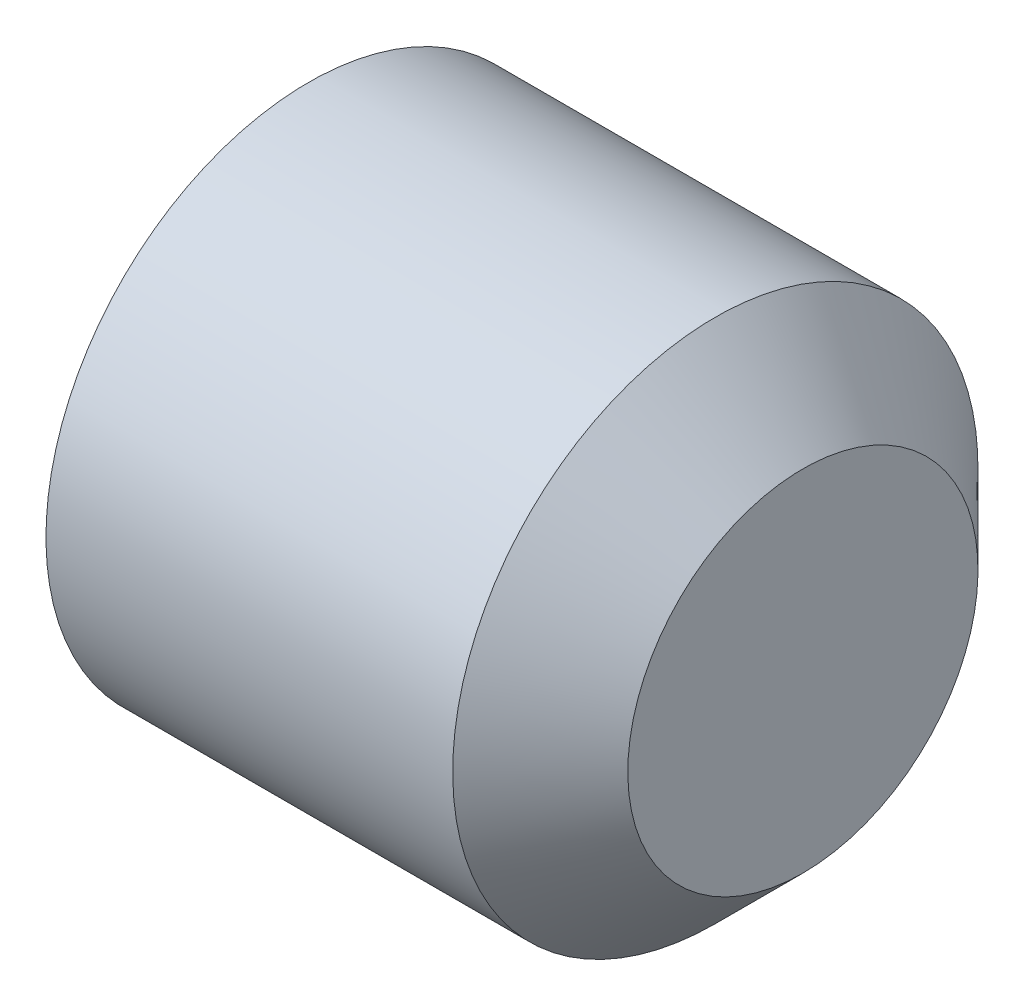
ISO-10303-21;
HEADER;
FILE_DESCRIPTION(('STEP AP214'),'2;1');
FILE_NAME('part.step','',(''),(''),'','','');
FILE_SCHEMA(('AUTOMOTIVE_DESIGN { 1 0 10303 214 1 1 1 1 }'));
ENDSEC;
DATA;
#1=APPLICATION_CONTEXT('core data for automotive mechanical design processes');
#2=APPLICATION_PROTOCOL_DEFINITION('international standard','automotive_design',2000,#1);
#3=PRODUCT_CONTEXT('',#1,'mechanical');
#4=PRODUCT('Part','Part','',(#3));
#5=PRODUCT_RELATED_PRODUCT_CATEGORY('part','',(#4));
#6=PRODUCT_DEFINITION_FORMATION('','',#4);
#7=PRODUCT_DEFINITION_CONTEXT('part definition',#1,'design');
#8=PRODUCT_DEFINITION('design','',#6,#7);
#9=PRODUCT_DEFINITION_SHAPE('','',#8);
#10=(LENGTH_UNIT() NAMED_UNIT(*) SI_UNIT(.MILLI.,.METRE.));
#11=(NAMED_UNIT(*) PLANE_ANGLE_UNIT() SI_UNIT($,.RADIAN.));
#12=(NAMED_UNIT(*) SI_UNIT($,.STERADIAN.) SOLID_ANGLE_UNIT());
#13=UNCERTAINTY_MEASURE_WITH_UNIT(LENGTH_MEASURE(1.E-05),#10,'distance_accuracy_value','');
#14=(GEOMETRIC_REPRESENTATION_CONTEXT(3) GLOBAL_UNCERTAINTY_ASSIGNED_CONTEXT((#13)) GLOBAL_UNIT_ASSIGNED_CONTEXT((#10,
#11,#12)) REPRESENTATION_CONTEXT('',''));
#15=CARTESIAN_POINT('',(0.,0.,0.));
#16=DIRECTION('',(0.,0.,1.));
#17=DIRECTION('',(1.,0.,0.));
#18=AXIS2_PLACEMENT_3D('',#15,#16,#17);
#19=CARTESIAN_POINT('',(0.5,0.,0.));
#20=DIRECTION('',(-1.,0.,0.));
#21=DIRECTION('',(0.,-1.,0.));
#22=AXIS2_PLACEMENT_3D('',#19,#20,#21);
#23=CONICAL_SURFACE('',#22,0.,1.0471975511966);
#24=CARTESIAN_POINT('',(0.,0.,0.));
#25=DIRECTION('',(-1.,0.,0.));
#26=DIRECTION('',(0.,-1.,0.));
#27=AXIS2_PLACEMENT_3D('',#24,#25,#26);
#28=CIRCLE('',#27,0.86602540378444);
#29=CARTESIAN_POINT('',(0.,0.,0.86602540378444));
#30=VERTEX_POINT('',#29);
#31=CARTESIAN_POINT('',(0.,0.75,0.433012701892222));
#32=VERTEX_POINT('',#31);
#33=EDGE_CURVE('E137',#30,#32,#28,.T.);
#34=ORIENTED_EDGE('',*,*,#33,.T.);
#35=CARTESIAN_POINT('',(-6.66799982216302E-05,0.7502,0.432897231838382));
#36=CARTESIAN_POINT('',(0.0109279672545947,0.717238666576004,0.451927466563575));
#37=CARTESIAN_POINT('',(0.0209278588304373,0.68399281869625,0.471121965786389));
#38=CARTESIAN_POINT('',(0.038384288073924,0.616925218141244,0.509843463020724));
#39=CARTESIAN_POINT('',(0.0458346476710156,0.583102272153654,0.529371149991445));
#40=CARTESIAN_POINT('',(0.0574342962607426,0.515875632570363,0.568184468451572));
#41=CARTESIAN_POINT('',(0.0616607517951379,0.482482293499614,0.58746412175321));
#42=CARTESIAN_POINT('',(0.0667098540533308,0.415538173911306,0.626114327218181));
#43=CARTESIAN_POINT('',(0.0675366780658326,0.381987637355588,0.645484738530082));
#44=CARTESIAN_POINT('',(0.065833231960248,0.319275698978884,0.681691493033275));
#45=CARTESIAN_POINT('',(0.0637212206264606,0.290104995811374,0.698533206359488));
#46=CARTESIAN_POINT('',(0.0570222121958374,0.231953671848458,0.73210688890321));
#47=CARTESIAN_POINT('',(0.0524329180465318,0.202973252776875,0.748838741655417));
#48=CARTESIAN_POINT('',(0.0409580031195664,0.144701650655193,0.782481866826481));
#49=CARTESIAN_POINT('',(0.0340236523302114,0.115417857581381,0.79938887264054));
#50=CARTESIAN_POINT('',(0.0182846224056368,0.0572874895838319,0.832950456252017));
#51=CARTESIAN_POINT('',(0.00948365081374576,0.0284401676519287,0.849605465334801));
#52=CARTESIAN_POINT('',(-6.66799982220191E-05,-0.000199999999999903,0.866140873838278));
#53=B_SPLINE_CURVE_WITH_KNOTS('',3,(#35,#36,#37,#38,#39,#40,#41,#42,#43,#44,#45,#46,#47,#48,#49,
#50,#51,#52),.UNSPECIFIED.,.F.,.F.,(4,2,2,2,2,2,2,2,4),(0.,0.118896819359341,0.238079744533805,
0.354311719456401,0.470400831872515,0.571553114284105,0.672799351342655,0.776293900714049,
0.87958477934405),.UNSPECIFIED.);
#54=EDGE_CURVE('E11',#32,#30,#53,.T.);
#55=ORIENTED_EDGE('',*,*,#54,.T.);
#56=EDGE_LOOP('',(#34,#55));
#57=FACE_BOUND('',#56,.T.);
#58=ADVANCED_FACE('F34',(#57),#23,.F.);
#59=CARTESIAN_POINT('',(0.,-0.75,0.43301270189222));
#60=VERTEX_POINT('',#59);
#61=EDGE_CURVE('E133',#60,#30,#28,.T.);
#62=ORIENTED_EDGE('',*,*,#61,.T.);
#63=CARTESIAN_POINT('',(-6.66799982221631E-05,0.000200000000000009,0.866140873838278));
#64=CARTESIAN_POINT('',(0.0109279672545943,-0.0327613334239957,0.847110639113085));
#65=CARTESIAN_POINT('',(0.0209278588304369,-0.0660071813037502,0.827916139890271));
#66=CARTESIAN_POINT('',(0.0383842880739238,-0.133074781858756,0.789194642655936));
#67=CARTESIAN_POINT('',(0.0458346476710154,-0.166897727846346,0.769666955685215));
#68=CARTESIAN_POINT('',(0.0574342962607425,-0.234124367429637,0.730853637225088));
#69=CARTESIAN_POINT('',(0.0616607517951379,-0.267517706500387,0.71157398392345));
#70=CARTESIAN_POINT('',(0.0667098540533308,-0.334461826088694,0.672923778458478));
#71=CARTESIAN_POINT('',(0.0675366780658327,-0.368012362644413,0.653553367146578));
#72=CARTESIAN_POINT('',(0.0658332319602481,-0.430724301021117,0.617346612643384));
#73=CARTESIAN_POINT('',(0.0637212206264609,-0.459895004188626,0.600504899317172));
#74=CARTESIAN_POINT('',(0.0570222121958376,-0.518046328151543,0.566931216773449));
#75=CARTESIAN_POINT('',(0.0524329180465321,-0.547026747223125,0.550199364021243));
#76=CARTESIAN_POINT('',(0.0409580031195668,-0.605298349344807,0.516556238850179));
#77=CARTESIAN_POINT('',(0.0340236523302119,-0.634582142418619,0.49964923303612));
#78=CARTESIAN_POINT('',(0.0182846224056374,-0.692712510416168,0.466087649424643));
#79=CARTESIAN_POINT('',(0.00948365081374636,-0.721559832348072,0.449432640341859));
#80=CARTESIAN_POINT('',(-6.6679998221416E-05,-0.7502,0.432897231838382));
#81=B_SPLINE_CURVE_WITH_KNOTS('',3,(#63,#64,#65,#66,#67,#68,#69,#70,#71,#72,#73,#74,#75,#76,#77,
#78,#79,#80),.UNSPECIFIED.,.F.,.F.,(4,2,2,2,2,2,2,2,4),(0.,0.118896819359341,0.238079744533806,
0.354311719456402,0.470400831872516,0.571553114284106,0.672799351342656,0.776293900714049,
0.87958477934405),.UNSPECIFIED.);
#82=EDGE_CURVE('E48',#30,#60,#81,.T.);
#83=ORIENTED_EDGE('',*,*,#82,.T.);
#84=EDGE_LOOP('',(#62,#83));
#85=FACE_BOUND('',#84,.T.);
#86=ADVANCED_FACE('F208',(#85),#23,.F.);
#87=CARTESIAN_POINT('',(0.,-0.75,-0.43301270189222));
#88=VERTEX_POINT('',#87);
#89=EDGE_CURVE('E132',#88,#60,#28,.T.);
#90=ORIENTED_EDGE('',*,*,#89,.T.);
#91=CARTESIAN_POINT('',(-0.278876466554599,-0.75,-1.1213588410753));
#92=CARTESIAN_POINT('',(-0.263336265513847,-0.75,-1.08897094569566));
#93=CARTESIAN_POINT('',(-0.247960254101356,-0.75,-1.05650461769235));
#94=CARTESIAN_POINT('',(-0.217622574828427,-0.75,-0.991372108674821));
#95=CARTESIAN_POINT('',(-0.202660981535683,-0.75,-0.958705892968621));
#96=CARTESIAN_POINT('',(-0.158358865523063,-0.75,-0.859967547804008));
#97=CARTESIAN_POINT('',(-0.129789394165184,-0.75,-0.793542929389712));
#98=CARTESIAN_POINT('',(-0.0751843648621228,-0.75,-0.657624750625179));
#99=CARTESIAN_POINT('',(-0.0492343798449783,-0.75,-0.588096337629301));
#100=CARTESIAN_POINT('',(-0.00305510516041329,-0.75,-0.4472488091812));
#101=CARTESIAN_POINT('',(0.0171890364428777,-0.75,-0.375934878791921));
#102=CARTESIAN_POINT('',(0.0406681724723913,-0.75,-0.267524989845908));
#103=CARTESIAN_POINT('',(0.047343676087413,-0.75,-0.23118312239164));
#104=CARTESIAN_POINT('',(0.0579431761785595,-0.75,-0.15809165305082));
#105=CARTESIAN_POINT('',(0.0618673585946982,-0.75,-0.121342078888484));
#106=CARTESIAN_POINT('',(0.0666007642621427,-0.75,-0.0480795367926938));
#107=CARTESIAN_POINT('',(0.0674467462415029,-0.75,-0.0115690096358278));
#108=CARTESIAN_POINT('',(0.0660502662725582,-0.75,0.0613915172782877));
#109=CARTESIAN_POINT('',(0.0638076130857623,-0.75,0.0978415131477214));
#110=CARTESIAN_POINT('',(0.0546612587546505,-0.75,0.187777191706421));
#111=CARTESIAN_POINT('',(0.0460435794249811,-0.75,0.241088938334563));
#112=CARTESIAN_POINT('',(0.0238197624153013,-0.75,0.346671776891812));
#113=CARTESIAN_POINT('',(0.0102076124427648,-0.75,0.398941534194197));
#114=CARTESIAN_POINT('',(-0.0209022912180242,-0.75,0.503561794942341));
#115=CARTESIAN_POINT('',(-0.0384803755428799,-0.75,0.555887795146071));
#116=CARTESIAN_POINT('',(-0.0761733658266929,-0.75,0.659578738588569));
#117=CARTESIAN_POINT('',(-0.0962873812846859,-0.75,0.710944011954183));
#118=CARTESIAN_POINT('',(-0.150040559931433,-0.75,0.841609169334977));
#119=CARTESIAN_POINT('',(-0.184929491266454,-0.75,0.92038989884234));
#120=CARTESIAN_POINT('',(-0.257158245348334,-0.75,1.07682093489163));
#121=CARTESIAN_POINT('',(-0.294498696792946,-0.75,1.15447094517097));
#122=CARTESIAN_POINT('',(-0.370753350440448,-0.75,1.30910230028642));
#123=CARTESIAN_POINT('',(-0.409669312305082,-0.75,1.38608277390296));
#124=CARTESIAN_POINT('',(-0.488505273193592,-0.75,1.53952831971992));
#125=CARTESIAN_POINT('',(-0.528425305368566,-0.75,1.61599337479695));
#126=CARTESIAN_POINT('',(-0.6051521411833,-0.75,1.76135282602859));
#127=CARTESIAN_POINT('',(-0.641896830705147,-0.75,1.83028007942956));
#128=CARTESIAN_POINT('',(-0.715804702425086,-0.75,1.9679128537899));
#129=CARTESIAN_POINT('',(-0.752967900110791,-0.75,2.0366183664215));
#130=CARTESIAN_POINT('',(-0.827513082986854,-0.75,2.17368403451686));
#131=CARTESIAN_POINT('',(-0.864894271247797,-0.75,2.24204462391346));
#132=CARTESIAN_POINT('',(-0.939899942981136,-0.75,2.37862759491475));
#133=CARTESIAN_POINT('',(-0.977524413618781,-0.75,2.44684998356505));
#134=CARTESIAN_POINT('',(-1.01523807504823,-0.75,2.51502271803409));
#135=B_SPLINE_CURVE_WITH_KNOTS('',3,(#91,#92,#93,#94,#95,#96,#97,#98,#99,#100,#101,#102,#103,
#104,#105,#106,#107,#108,#109,#110,#111,#112,#113,#114,#115,#116,#117,#118,#119,#120,#121,#122,
#123,#124,#125,#126,#127,#128,#129,#130,#131,#132,#133,#134),.UNSPECIFIED.,.F.,.F.,(4,2,2,2,2,2,
2,2,2,2,2,2,2,2,2,2,2,2,2,2,2,4),(0.,0.107767756928781,0.215554780551915,0.432420251910877,
0.654944617818952,0.876884302501297,0.987647541221339,1.0984032936094,1.20783201912744,
1.31726752042964,1.47894399847128,1.64081574297878,1.8063195007273,1.97176530228984,
2.23016383407581,2.48862889356041,2.74739105429863,3.00616176975601,3.24048926348677,
3.47482545759373,3.70856560604661,3.94229352217274),.UNSPECIFIED.);
#136=EDGE_CURVE('E182',#60,#88,#135,.F.);
#137=ORIENTED_EDGE('',*,*,#136,.T.);
#138=EDGE_LOOP('',(#90,#137));
#139=FACE_BOUND('',#138,.T.);
#140=ADVANCED_FACE('F214',(#139),#23,.F.);
#141=CARTESIAN_POINT('',(0.,0.,-0.86602540378444));
#142=VERTEX_POINT('',#141);
#143=EDGE_CURVE('E236',#142,#88,#28,.T.);
#144=ORIENTED_EDGE('',*,*,#143,.T.);
#145=CARTESIAN_POINT('',(-6.66799982214356E-05,-0.7502,-0.432897231838382));
#146=CARTESIAN_POINT('',(0.0109279672545948,-0.717238666576004,-0.451927466563575));
#147=CARTESIAN_POINT('',(0.0209278588304374,-0.68399281869625,-0.471121965786389));
#148=CARTESIAN_POINT('',(0.0383842880739242,-0.616925218141244,-0.509843463020724));
#149=CARTESIAN_POINT('',(0.0458346476710158,-0.583102272153654,-0.529371149991445));
#150=CARTESIAN_POINT('',(0.0574342962607427,-0.515875632570363,-0.568184468451572));
#151=CARTESIAN_POINT('',(0.061660751795138,-0.482482293499614,-0.58746412175321));
#152=CARTESIAN_POINT('',(0.0667098540533309,-0.415538173911306,-0.626114327218181));
#153=CARTESIAN_POINT('',(0.0675366780658328,-0.381987637355587,-0.645484738530082));
#154=CARTESIAN_POINT('',(0.0658332319602481,-0.319275698978883,-0.681691493033275));
#155=CARTESIAN_POINT('',(0.0637212206264607,-0.290104995811374,-0.698533206359488));
#156=CARTESIAN_POINT('',(0.0570222121958373,-0.231953671848458,-0.732106888903211));
#157=CARTESIAN_POINT('',(0.0524329180465317,-0.202973252776875,-0.748838741655417));
#158=CARTESIAN_POINT('',(0.0409580031195663,-0.144701650655193,-0.782481866826481));
#159=CARTESIAN_POINT('',(0.0340236523302114,-0.115417857581381,-0.79938887264054));
#160=CARTESIAN_POINT('',(0.0182846224056368,-0.0572874895838316,-0.832950456252017));
#161=CARTESIAN_POINT('',(0.00948365081374577,-0.0284401676519285,-0.849605465334801));
#162=CARTESIAN_POINT('',(-6.66799982221086E-05,0.000200000000000049,-0.866140873838278));
#163=B_SPLINE_CURVE_WITH_KNOTS('',3,(#145,#146,#147,#148,#149,#150,#151,#152,#153,#154,#155,
#156,#157,#158,#159,#160,#161,#162),.UNSPECIFIED.,.F.,.F.,(4,2,2,2,2,2,2,2,4),(0.,
0.118896819359341,0.238079744533805,0.354311719456401,0.470400831872516,0.571553114284106,
0.672799351342655,0.776293900714049,0.87958477934405),.UNSPECIFIED.);
#164=EDGE_CURVE('E176',#88,#142,#163,.T.);
#165=ORIENTED_EDGE('',*,*,#164,.T.);
#166=EDGE_LOOP('',(#144,#165));
#167=FACE_BOUND('',#166,.T.);
#168=ADVANCED_FACE('F226',(#167),#23,.F.);
#169=CARTESIAN_POINT('',(0.,0.75,-0.43301270189222));
#170=VERTEX_POINT('',#169);
#171=EDGE_CURVE('E234',#170,#142,#28,.T.);
#172=ORIENTED_EDGE('',*,*,#171,.T.);
#173=CARTESIAN_POINT('',(-6.66799982221631E-05,-0.000200000000000009,-0.866140873838278));
#174=CARTESIAN_POINT('',(0.0109279672545942,0.0327613334239957,-0.847110639113085));
#175=CARTESIAN_POINT('',(0.0209278588304369,0.0660071813037503,-0.827916139890271));
#176=CARTESIAN_POINT('',(0.0383842880739237,0.133074781858756,-0.789194642655936));
#177=CARTESIAN_POINT('',(0.0458346476710154,0.166897727846346,-0.769666955685215));
#178=CARTESIAN_POINT('',(0.0574342962607424,0.234124367429637,-0.730853637225088));
#179=CARTESIAN_POINT('',(0.0616607517951378,0.267517706500387,-0.71157398392345));
#180=CARTESIAN_POINT('',(0.0667098540533307,0.334461826088694,-0.672923778458478));
#181=CARTESIAN_POINT('',(0.0675366780658325,0.368012362644413,-0.653553367146578));
#182=CARTESIAN_POINT('',(0.065833231960248,0.430724301021117,-0.617346612643384));
#183=CARTESIAN_POINT('',(0.0637212206264608,0.459895004188626,-0.600504899317172));
#184=CARTESIAN_POINT('',(0.0570222121958376,0.518046328151543,-0.566931216773449));
#185=CARTESIAN_POINT('',(0.052432918046532,0.547026747223125,-0.550199364021243));
#186=CARTESIAN_POINT('',(0.0409580031195667,0.605298349344807,-0.516556238850179));
#187=CARTESIAN_POINT('',(0.0340236523302118,0.63458214241862,-0.49964923303612));
#188=CARTESIAN_POINT('',(0.0182846224056372,0.692712510416168,-0.466087649424643));
#189=CARTESIAN_POINT('',(0.00948365081374617,0.721559832348071,-0.449432640341859));
#190=CARTESIAN_POINT('',(-6.66799982216486E-05,0.7502,-0.432897231838382));
#191=B_SPLINE_CURVE_WITH_KNOTS('',3,(#173,#174,#175,#176,#177,#178,#179,#180,#181,#182,#183,
#184,#185,#186,#187,#188,#189,#190),.UNSPECIFIED.,.F.,.F.,(4,2,2,2,2,2,2,2,4),(0.,
0.118896819359341,0.238079744533806,0.354311719456402,0.470400831872516,0.571553114284106,
0.672799351342656,0.776293900714049,0.87958477934405),.UNSPECIFIED.);
#192=EDGE_CURVE('E115',#142,#170,#191,.T.);
#193=ORIENTED_EDGE('',*,*,#192,.T.);
#194=EDGE_LOOP('',(#172,#193));
#195=FACE_BOUND('',#194,.T.);
#196=ADVANCED_FACE('F218',(#195),#23,.F.);
#197=EDGE_CURVE('E230',#32,#170,#28,.T.);
#198=ORIENTED_EDGE('',*,*,#197,.T.);
#199=CARTESIAN_POINT('',(-0.278876466554599,0.75,-1.1213588410753));
#200=CARTESIAN_POINT('',(-0.263336265513847,0.75,-1.08897094569566));
#201=CARTESIAN_POINT('',(-0.247960254101356,0.75,-1.05650461769235));
#202=CARTESIAN_POINT('',(-0.217622574828427,0.75,-0.99137210867482));
#203=CARTESIAN_POINT('',(-0.202660981535683,0.75,-0.958705892968621));
#204=CARTESIAN_POINT('',(-0.158358865523063,0.75,-0.859967547804008));
#205=CARTESIAN_POINT('',(-0.129789394165184,0.75,-0.793542929389712));
#206=CARTESIAN_POINT('',(-0.0751843648621231,0.75,-0.657624750625179));
#207=CARTESIAN_POINT('',(-0.0492343798449785,0.75,-0.588096337629301));
#208=CARTESIAN_POINT('',(-0.0030551051604135,0.75,-0.4472488091812));
#209=CARTESIAN_POINT('',(0.0171890364428774,0.75,-0.375934878791921));
#210=CARTESIAN_POINT('',(0.0406681724723912,0.75,-0.267524989845908));
#211=CARTESIAN_POINT('',(0.0473436760874129,0.75,-0.23118312239164));
#212=CARTESIAN_POINT('',(0.0579431761785593,0.75,-0.15809165305082));
#213=CARTESIAN_POINT('',(0.061867358594698,0.75,-0.121342078888484));
#214=CARTESIAN_POINT('',(0.0666007642621425,0.75,-0.0480795367926938));
#215=CARTESIAN_POINT('',(0.0674467462415028,0.75,-0.0115690096358278));
#216=CARTESIAN_POINT('',(0.0660502662725581,0.75,0.0613915172782877));
#217=CARTESIAN_POINT('',(0.0638076130857623,0.75,0.0978415131477215));
#218=CARTESIAN_POINT('',(0.0546612587546504,0.75,0.187777191706421));
#219=CARTESIAN_POINT('',(0.0460435794249809,0.75,0.241088938334563));
#220=CARTESIAN_POINT('',(0.023819762415301,0.75,0.346671776891812));
#221=CARTESIAN_POINT('',(0.0102076124427646,0.75,0.398941534194198));
#222=CARTESIAN_POINT('',(-0.0209022912180244,0.75,0.503561794942341));
#223=CARTESIAN_POINT('',(-0.0384803755428802,0.75,0.555887795146071));
#224=CARTESIAN_POINT('',(-0.0761733658266932,0.75,0.659578738588569));
#225=CARTESIAN_POINT('',(-0.0962873812846861,0.75,0.710944011954183));
#226=CARTESIAN_POINT('',(-0.150040559931434,0.75,0.841609169334977));
#227=CARTESIAN_POINT('',(-0.184929491266455,0.75,0.92038989884234));
#228=CARTESIAN_POINT('',(-0.257158245348335,0.75,1.07682093489163));
#229=CARTESIAN_POINT('',(-0.294498696792946,0.75,1.15447094517097));
#230=CARTESIAN_POINT('',(-0.370753350440449,0.75,1.30910230028643));
#231=CARTESIAN_POINT('',(-0.409669312305082,0.75,1.38608277390296));
#232=CARTESIAN_POINT('',(-0.488505273193592,0.75,1.53952831971992));
#233=CARTESIAN_POINT('',(-0.528425305368567,0.75,1.61599337479695));
#234=CARTESIAN_POINT('',(-0.605152141183301,0.75,1.76135282602859));
#235=CARTESIAN_POINT('',(-0.641896830705147,0.75,1.83028007942956));
#236=CARTESIAN_POINT('',(-0.715804702425086,0.75,1.9679128537899));
#237=CARTESIAN_POINT('',(-0.752967900110792,0.75,2.0366183664215));
#238=CARTESIAN_POINT('',(-0.827513082986854,0.75,2.17368403451686));
#239=CARTESIAN_POINT('',(-0.864894271247797,0.75,2.24204462391346));
#240=CARTESIAN_POINT('',(-0.939899942981136,0.75,2.37862759491475));
#241=CARTESIAN_POINT('',(-0.977524413618781,0.75,2.44684998356505));
#242=CARTESIAN_POINT('',(-1.01523807504823,0.75,2.51502271803409));
#243=B_SPLINE_CURVE_WITH_KNOTS('',3,(#199,#200,#201,#202,#203,#204,#205,#206,#207,#208,#209,
#210,#211,#212,#213,#214,#215,#216,#217,#218,#219,#220,#221,#222,#223,#224,#225,#226,#227,#228,
#229,#230,#231,#232,#233,#234,#235,#236,#237,#238,#239,#240,#241,#242),.UNSPECIFIED.,.F.,.F.,(4,
2,2,2,2,2,2,2,2,2,2,2,2,2,2,2,2,2,2,2,2,4),(0.,0.107767756928781,0.215554780551915,
0.432420251910877,0.654944617818951,0.876884302501296,0.987647541221338,1.0984032936094,
1.20783201912744,1.31726752042963,1.47894399847128,1.64081574297878,1.8063195007273,
1.97176530228984,2.23016383407581,2.48862889356041,2.74739105429863,3.00616176975601,
3.24048926348677,3.47482545759373,3.70856560604661,3.94229352217274),.UNSPECIFIED.);
#244=EDGE_CURVE('E81',#170,#32,#243,.T.);
#245=ORIENTED_EDGE('',*,*,#244,.T.);
#246=EDGE_LOOP('',(#198,#245));
#247=FACE_BOUND('',#246,.T.);
#248=ADVANCED_FACE('F210',(#247),#23,.F.);
#249=CARTESIAN_POINT('',(3.,0.,0.));
#250=DIRECTION('',(1.,0.,0.));
#251=DIRECTION('',(0.,1.,0.));
#252=AXIS2_PLACEMENT_3D('',#249,#250,#251);
#253=PLANE('',#252);
#254=CARTESIAN_POINT('',(3.,0.,0.));
#255=DIRECTION('',(-1.,0.,0.));
#256=DIRECTION('',(0.,-1.,0.));
#257=AXIS2_PLACEMENT_3D('',#254,#255,#256);
#258=CIRCLE('',#257,1.);
#259=CARTESIAN_POINT('',(3.,-1.,0.));
#260=VERTEX_POINT('',#259);
#261=EDGE_CURVE('E146',#260,#260,#258,.T.);
#262=ORIENTED_EDGE('',*,*,#261,.F.);
#263=EDGE_LOOP('',(#262));
#264=FACE_BOUND('',#263,.T.);
#265=ADVANCED_FACE('F36',(#264),#253,.T.);
#266=CARTESIAN_POINT('',(2.5,0.,0.));
#267=DIRECTION('',(-1.,0.,0.));
#268=DIRECTION('',(0.,-1.,0.));
#269=AXIS2_PLACEMENT_3D('',#266,#267,#268);
#270=CONICAL_SURFACE('',#269,1.5,0.785398163397448);
#271=ORIENTED_EDGE('',*,*,#261,.T.);
#272=EDGE_LOOP('',(#271));
#273=FACE_BOUND('',#272,.T.);
#274=CARTESIAN_POINT('',(2.5,0.,0.));
#275=DIRECTION('',(-1.,0.,0.));
#276=DIRECTION('',(0.,-1.,0.));
#277=AXIS2_PLACEMENT_3D('',#274,#275,#276);
#278=CIRCLE('',#277,1.5);
#279=CARTESIAN_POINT('',(2.5,-1.5,0.));
#280=VERTEX_POINT('',#279);
#281=EDGE_CURVE('E143',#280,#280,#278,.T.);
#282=ORIENTED_EDGE('',*,*,#281,.F.);
#283=EDGE_LOOP('',(#282));
#284=FACE_BOUND('',#283,.T.);
#285=ADVANCED_FACE('F224',(#273,#284),#270,.T.);
#286=CARTESIAN_POINT('',(0.5,0.,0.));
#287=DIRECTION('',(-1.,0.,0.));
#288=DIRECTION('',(0.,-1.,0.));
#289=AXIS2_PLACEMENT_3D('',#286,#287,#288);
#290=CYLINDRICAL_SURFACE('',#289,1.5);
#291=ORIENTED_EDGE('',*,*,#281,.T.);
#292=EDGE_LOOP('',(#291));
#293=FACE_BOUND('',#292,.T.);
#294=CARTESIAN_POINT('',(0.17695785750662,0.,0.));
#295=DIRECTION('',(-1.,0.,0.));
#296=DIRECTION('',(0.,-1.,0.));
#297=AXIS2_PLACEMENT_3D('',#294,#295,#296);
#298=CIRCLE('',#297,1.5);
#299=CARTESIAN_POINT('',(0.17695785750662,-1.5,0.));
#300=VERTEX_POINT('',#299);
#301=EDGE_CURVE('E140',#300,#300,#298,.T.);
#302=ORIENTED_EDGE('',*,*,#301,.F.);
#303=EDGE_LOOP('',(#302));
#304=FACE_BOUND('',#303,.T.);
#305=ADVANCED_FACE('F333',(#293,#304),#290,.T.);
#306=CARTESIAN_POINT('',(0.,0.,0.));
#307=DIRECTION('',(1.,0.,0.));
#308=DIRECTION('',(0.,1.,0.));
#309=AXIS2_PLACEMENT_3D('',#306,#307,#308);
#310=CONICAL_SURFACE('',#309,1.1935,1.0471975511966);
#311=ORIENTED_EDGE('',*,*,#301,.T.);
#312=EDGE_LOOP('',(#311));
#313=FACE_BOUND('',#312,.T.);
#314=CARTESIAN_POINT('',(0.,0.,0.));
#315=DIRECTION('',(-1.,0.,0.));
#316=DIRECTION('',(0.,-1.,0.));
#317=AXIS2_PLACEMENT_3D('',#314,#315,#316);
#318=CIRCLE('',#317,1.1935);
#319=CARTESIAN_POINT('',(0.,-1.1935,0.));
#320=VERTEX_POINT('',#319);
#321=EDGE_CURVE('E136',#320,#320,#318,.T.);
#322=ORIENTED_EDGE('',*,*,#321,.F.);
#323=EDGE_LOOP('',(#322));
#324=FACE_BOUND('',#323,.T.);
#325=ADVANCED_FACE('F205',(#313,#324),#310,.T.);
#326=CARTESIAN_POINT('',(0.,-1.1935,0.));
#327=DIRECTION('',(-1.,0.,0.));
#328=DIRECTION('',(0.,-1.,0.));
#329=AXIS2_PLACEMENT_3D('',#326,#327,#328);
#330=PLANE('',#329);
#331=ORIENTED_EDGE('',*,*,#321,.T.);
#332=EDGE_LOOP('',(#331));
#333=FACE_BOUND('',#332,.T.);
#334=ORIENTED_EDGE('',*,*,#61,.F.);
#335=ORIENTED_EDGE('',*,*,#89,.F.);
#336=ORIENTED_EDGE('',*,*,#143,.F.);
#337=ORIENTED_EDGE('',*,*,#171,.F.);
#338=ORIENTED_EDGE('',*,*,#197,.F.);
#339=ORIENTED_EDGE('',*,*,#33,.F.);
#340=EDGE_LOOP('',(#334,#335,#336,#337,#338,#339));
#341=FACE_BOUND('',#340,.T.);
#342=ADVANCED_FACE('F200',(#333,#341),#330,.T.);
#343=CARTESIAN_POINT('',(1.2,0.75,0.43301270189222));
#344=DIRECTION('',(0.,-0.500000000000001,-0.866025403784438));
#345=DIRECTION('',(0.,0.866025403784438,-0.500000000000001));
#346=AXIS2_PLACEMENT_3D('',#343,#344,#345);
#347=PLANE('',#346);
#348=DIRECTION('',(-1.,0.,0.));
#349=VECTOR('',#348,1.);
#350=CARTESIAN_POINT('',(1.2,0.75,0.43301270189222));
#351=LINE('',#350,#349);
#352=CARTESIAN_POINT('',(1.2,0.75,0.43301270189222));
#353=VERTEX_POINT('',#352);
#354=EDGE_CURVE('E55',#353,#32,#351,.T.);
#355=ORIENTED_EDGE('',*,*,#354,.F.);
#356=DIRECTION('',(0.,-0.866025403784438,0.500000000000001));
#357=VECTOR('',#356,1.);
#358=CARTESIAN_POINT('',(1.2,0.75,0.43301270189222));
#359=LINE('',#358,#357);
#360=CARTESIAN_POINT('',(1.2,0.,0.86602540378444));
#361=VERTEX_POINT('',#360);
#362=EDGE_CURVE('E246',#353,#361,#359,.T.);
#363=ORIENTED_EDGE('',*,*,#362,.T.);
#364=DIRECTION('',(-1.,0.,0.));
#365=VECTOR('',#364,1.);
#366=CARTESIAN_POINT('',(1.2,0.,0.86602540378444));
#367=LINE('',#366,#365);
#368=EDGE_CURVE('E129',#361,#30,#367,.T.);
#369=ORIENTED_EDGE('',*,*,#368,.T.);
#370=ORIENTED_EDGE('',*,*,#54,.F.);
#371=EDGE_LOOP('',(#355,#363,#369,#370));
#372=FACE_BOUND('',#371,.T.);
#373=ADVANCED_FACE('F196',(#372),#347,.T.);
#374=CARTESIAN_POINT('',(1.2,0.,0.86602540378444));
#375=DIRECTION('',(0.,0.500000000000001,-0.866025403784438));
#376=DIRECTION('',(0.,0.866025403784438,0.500000000000001));
#377=AXIS2_PLACEMENT_3D('',#374,#375,#376);
#378=PLANE('',#377);
#379=ORIENTED_EDGE('',*,*,#368,.F.);
#380=DIRECTION('',(0.,-0.866025403784438,-0.500000000000001));
#381=VECTOR('',#380,1.);
#382=CARTESIAN_POINT('',(1.2,0.,0.86602540378444));
#383=LINE('',#382,#381);
#384=CARTESIAN_POINT('',(1.2,-0.75,0.43301270189222));
#385=VERTEX_POINT('',#384);
#386=EDGE_CURVE('E90',#361,#385,#383,.T.);
#387=ORIENTED_EDGE('',*,*,#386,.T.);
#388=DIRECTION('',(-1.,0.,0.));
#389=VECTOR('',#388,1.);
#390=CARTESIAN_POINT('',(1.2,-0.75,0.43301270189222));
#391=LINE('',#390,#389);
#392=EDGE_CURVE('E126',#385,#60,#391,.T.);
#393=ORIENTED_EDGE('',*,*,#392,.T.);
#394=ORIENTED_EDGE('',*,*,#82,.F.);
#395=EDGE_LOOP('',(#379,#387,#393,#394));
#396=FACE_BOUND('',#395,.T.);
#397=ADVANCED_FACE('F193',(#396),#378,.T.);
#398=CARTESIAN_POINT('',(1.2,-0.75,0.43301270189222));
#399=DIRECTION('',(0.,1.,0.));
#400=DIRECTION('',(0.,0.,1.));
#401=AXIS2_PLACEMENT_3D('',#398,#399,#400);
#402=PLANE('',#401);
#403=ORIENTED_EDGE('',*,*,#392,.F.);
#404=DIRECTION('',(0.,0.,-1.));
#405=VECTOR('',#404,1.);
#406=CARTESIAN_POINT('',(1.2,-0.75,0.43301270189222));
#407=LINE('',#406,#405);
#408=CARTESIAN_POINT('',(1.2,-0.75,-0.43301270189222));
#409=VERTEX_POINT('',#408);
#410=EDGE_CURVE('E110',#385,#409,#407,.T.);
#411=ORIENTED_EDGE('',*,*,#410,.T.);
#412=DIRECTION('',(-1.,0.,0.));
#413=VECTOR('',#412,1.);
#414=CARTESIAN_POINT('',(1.2,-0.75,-0.43301270189222));
#415=LINE('',#414,#413);
#416=EDGE_CURVE('E107',#409,#88,#415,.T.);
#417=ORIENTED_EDGE('',*,*,#416,.T.);
#418=ORIENTED_EDGE('',*,*,#136,.F.);
#419=EDGE_LOOP('',(#403,#411,#417,#418));
#420=FACE_BOUND('',#419,.T.);
#421=ADVANCED_FACE('F173',(#420),#402,.T.);
#422=CARTESIAN_POINT('',(1.2,-0.75,-0.43301270189222));
#423=DIRECTION('',(0.,0.500000000000001,0.866025403784438));
#424=DIRECTION('',(0.,-0.866025403784438,0.500000000000001));
#425=AXIS2_PLACEMENT_3D('',#422,#423,#424);
#426=PLANE('',#425);
#427=ORIENTED_EDGE('',*,*,#416,.F.);
#428=DIRECTION('',(0.,0.866025403784438,-0.500000000000001));
#429=VECTOR('',#428,1.);
#430=CARTESIAN_POINT('',(1.2,-0.75,-0.43301270189222));
#431=LINE('',#430,#429);
#432=CARTESIAN_POINT('',(1.2,0.,-0.86602540378444));
#433=VERTEX_POINT('',#432);
#434=EDGE_CURVE('E101',#409,#433,#431,.T.);
#435=ORIENTED_EDGE('',*,*,#434,.T.);
#436=DIRECTION('',(-1.,0.,0.));
#437=VECTOR('',#436,1.);
#438=CARTESIAN_POINT('',(1.2,0.,-0.86602540378444));
#439=LINE('',#438,#437);
#440=EDGE_CURVE('E104',#433,#142,#439,.T.);
#441=ORIENTED_EDGE('',*,*,#440,.T.);
#442=ORIENTED_EDGE('',*,*,#164,.F.);
#443=EDGE_LOOP('',(#427,#435,#441,#442));
#444=FACE_BOUND('',#443,.T.);
#445=ADVANCED_FACE('F103',(#444),#426,.T.);
#446=CARTESIAN_POINT('',(1.2,0.,-0.86602540378444));
#447=DIRECTION('',(0.,-0.500000000000001,0.866025403784438));
#448=DIRECTION('',(0.,-0.866025403784438,-0.500000000000001));
#449=AXIS2_PLACEMENT_3D('',#446,#447,#448);
#450=PLANE('',#449);
#451=ORIENTED_EDGE('',*,*,#440,.F.);
#452=DIRECTION('',(0.,0.866025403784438,0.500000000000001));
#453=VECTOR('',#452,1.);
#454=CARTESIAN_POINT('',(1.2,0.,-0.86602540378444));
#455=LINE('',#454,#453);
#456=CARTESIAN_POINT('',(1.2,0.75,-0.43301270189222));
#457=VERTEX_POINT('',#456);
#458=EDGE_CURVE('E109',#433,#457,#455,.T.);
#459=ORIENTED_EDGE('',*,*,#458,.T.);
#460=DIRECTION('',(-1.,0.,0.));
#461=VECTOR('',#460,1.);
#462=CARTESIAN_POINT('',(1.2,0.75,-0.43301270189222));
#463=LINE('',#462,#461);
#464=EDGE_CURVE('E116',#457,#170,#463,.T.);
#465=ORIENTED_EDGE('',*,*,#464,.T.);
#466=ORIENTED_EDGE('',*,*,#192,.F.);
#467=EDGE_LOOP('',(#451,#459,#465,#466));
#468=FACE_BOUND('',#467,.T.);
#469=ADVANCED_FACE('F113',(#468),#450,.T.);
#470=CARTESIAN_POINT('',(1.2,0.75,-0.43301270189222));
#471=DIRECTION('',(0.,-1.,0.));
#472=DIRECTION('',(0.,0.,-1.));
#473=AXIS2_PLACEMENT_3D('',#470,#471,#472);
#474=PLANE('',#473);
#475=ORIENTED_EDGE('',*,*,#464,.F.);
#476=DIRECTION('',(0.,0.,1.));
#477=VECTOR('',#476,1.);
#478=CARTESIAN_POINT('',(1.2,0.75,-0.43301270189222));
#479=LINE('',#478,#477);
#480=EDGE_CURVE('E61',#457,#353,#479,.T.);
#481=ORIENTED_EDGE('',*,*,#480,.T.);
#482=ORIENTED_EDGE('',*,*,#354,.T.);
#483=ORIENTED_EDGE('',*,*,#244,.F.);
#484=EDGE_LOOP('',(#475,#481,#482,#483));
#485=FACE_BOUND('',#484,.T.);
#486=ADVANCED_FACE('F163',(#485),#474,.T.);
#487=CARTESIAN_POINT('',(1.2,0.,0.));
#488=DIRECTION('',(1.,0.,0.));
#489=DIRECTION('',(0.,0.,-1.));
#490=AXIS2_PLACEMENT_3D('',#487,#488,#489);
#491=PLANE('',#490);
#492=ORIENTED_EDGE('',*,*,#362,.F.);
#493=ORIENTED_EDGE('',*,*,#480,.F.);
#494=ORIENTED_EDGE('',*,*,#458,.F.);
#495=ORIENTED_EDGE('',*,*,#434,.F.);
#496=ORIENTED_EDGE('',*,*,#410,.F.);
#497=ORIENTED_EDGE('',*,*,#386,.F.);
#498=EDGE_LOOP('',(#492,#493,#494,#495,#496,#497));
#499=FACE_BOUND('',#498,.T.);
#500=ADVANCED_FACE('F118',(#499),#491,.F.);
#501=CLOSED_SHELL('',(#58,#86,#140,#168,#196,#248,#265,#285,#305,#325,#342,#373,#397,#421,#445,
#469,#486,#500));
#502=MANIFOLD_SOLID_BREP('B2',#501);
#503=ADVANCED_BREP_SHAPE_REPRESENTATION('',(#18,#502),#14);
#504=SHAPE_DEFINITION_REPRESENTATION(#9,#503);
ENDSEC;
END-ISO-10303-21;
